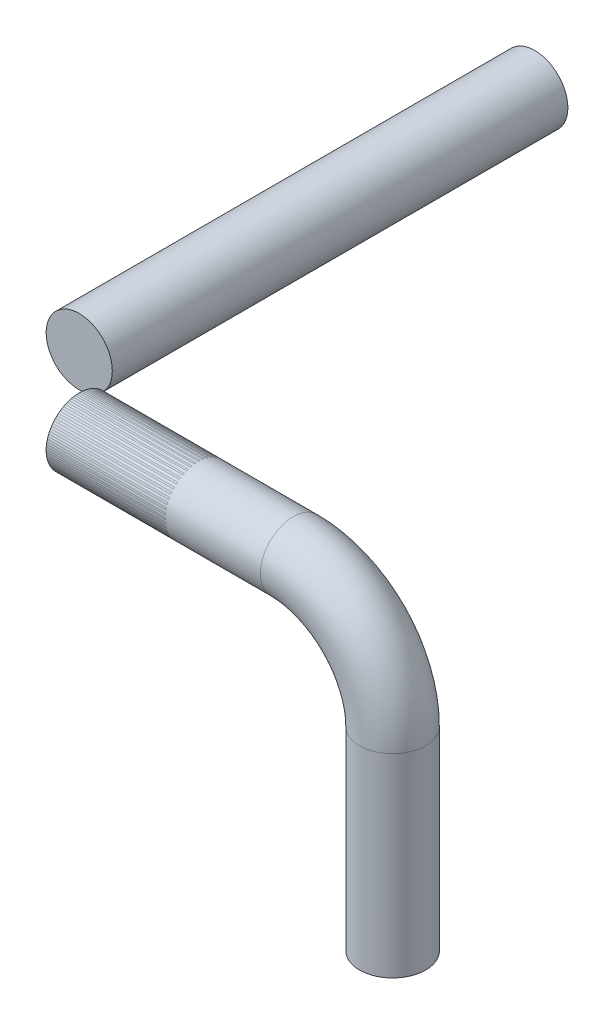
ISO-10303-21;
HEADER;
FILE_DESCRIPTION(('STEP AP214'),'2;1');
FILE_NAME('part.step','',(''),(''),'','','');
FILE_SCHEMA(('AUTOMOTIVE_DESIGN { 1 0 10303 214 1 1 1 1 }'));
ENDSEC;
DATA;
#1=APPLICATION_CONTEXT('core data for automotive mechanical design processes');
#2=APPLICATION_PROTOCOL_DEFINITION('international standard','automotive_design',2000,#1);
#3=PRODUCT_CONTEXT('',#1,'mechanical');
#4=PRODUCT('Part','Part','',(#3));
#5=PRODUCT_RELATED_PRODUCT_CATEGORY('part','',(#4));
#6=PRODUCT_DEFINITION_FORMATION('','',#4);
#7=PRODUCT_DEFINITION_CONTEXT('part definition',#1,'design');
#8=PRODUCT_DEFINITION('design','',#6,#7);
#9=PRODUCT_DEFINITION_SHAPE('','',#8);
#10=(LENGTH_UNIT() NAMED_UNIT(*) SI_UNIT(.MILLI.,.METRE.));
#11=(NAMED_UNIT(*) PLANE_ANGLE_UNIT() SI_UNIT($,.RADIAN.));
#12=(NAMED_UNIT(*) SI_UNIT($,.STERADIAN.) SOLID_ANGLE_UNIT());
#13=UNCERTAINTY_MEASURE_WITH_UNIT(LENGTH_MEASURE(1.E-05),#10,'distance_accuracy_value','');
#14=(GEOMETRIC_REPRESENTATION_CONTEXT(3) GLOBAL_UNCERTAINTY_ASSIGNED_CONTEXT((#13)) GLOBAL_UNIT_ASSIGNED_CONTEXT((#10,
#11,#12)) REPRESENTATION_CONTEXT('',''));
#15=CARTESIAN_POINT('',(0.,0.,0.));
#16=DIRECTION('',(0.,0.,1.));
#17=DIRECTION('',(1.,0.,0.));
#18=AXIS2_PLACEMENT_3D('',#15,#16,#17);
#19=CARTESIAN_POINT('',(0.,0.,84.0740000000007));
#20=DIRECTION('',(0.,0.,-1.));
#21=DIRECTION('',(-1.,0.,0.));
#22=AXIS2_PLACEMENT_3D('',#19,#20,#21);
#23=PLANE('',#22);
#24=CARTESIAN_POINT('',(0.,0.,84.0740000000007));
#25=DIRECTION('',(0.,0.,-1.));
#26=DIRECTION('',(-1.,0.,0.));
#27=AXIS2_PLACEMENT_3D('',#24,#25,#26);
#28=CIRCLE('',#27,6.35);
#29=CARTESIAN_POINT('',(-6.35,0.,84.0740000000007));
#30=VERTEX_POINT('',#29);
#31=EDGE_CURVE('E53',#30,#30,#28,.T.);
#32=ORIENTED_EDGE('',*,*,#31,.F.);
#33=EDGE_LOOP('',(#32));
#34=FACE_BOUND('',#33,.T.);
#35=ADVANCED_FACE('F46',(#34),#23,.F.);
#36=CARTESIAN_POINT('',(0.,0.,-21.3387122421383));
#37=DIRECTION('',(0.,0.,1.));
#38=DIRECTION('',(1.,0.,0.));
#39=AXIS2_PLACEMENT_3D('',#36,#37,#38);
#40=CYLINDRICAL_SURFACE('',#39,6.35);
#41=CARTESIAN_POINT('',(0.,0.,-3.37819999999999));
#42=DIRECTION('',(0.,0.,1.));
#43=DIRECTION('',(1.,0.,0.));
#44=AXIS2_PLACEMENT_3D('',#41,#42,#43);
#45=CIRCLE('',#44,6.35);
#46=CARTESIAN_POINT('',(6.35,0.,-3.37819999999999));
#47=VERTEX_POINT('',#46);
#48=EDGE_CURVE('E11',#47,#47,#45,.T.);
#49=ORIENTED_EDGE('',*,*,#48,.T.);
#50=EDGE_LOOP('',(#49));
#51=FACE_BOUND('',#50,.T.);
#52=ORIENTED_EDGE('',*,*,#31,.T.);
#53=EDGE_LOOP('',(#52));
#54=FACE_BOUND('',#53,.T.);
#55=ADVANCED_FACE('F48',(#51,#54),#40,.T.);
#56=CARTESIAN_POINT('',(0.,0.,-3.37819999999999));
#57=DIRECTION('',(0.,0.,1.));
#58=DIRECTION('',(1.,0.,0.));
#59=AXIS2_PLACEMENT_3D('',#56,#57,#58);
#60=PLANE('',#59);
#61=ORIENTED_EDGE('',*,*,#48,.F.);
#62=EDGE_LOOP('',(#61));
#63=FACE_BOUND('',#62,.T.);
#64=ADVANCED_FACE('F64',(#63),#60,.F.);
#65=CLOSED_SHELL('',(#35,#55,#64));
#66=MANIFOLD_SOLID_BREP('B2',#65);
#67=CARTESIAN_POINT('',(54.3147558894614,0.,97.2819999999932));
#68=DIRECTION('',(-1.,0.,0.));
#69=DIRECTION('',(0.,-1.,0.));
#70=AXIS2_PLACEMENT_3D('',#67,#68,#69);
#71=CYLINDRICAL_SURFACE('',#70,6.34999999999005);
#72=CARTESIAN_POINT('',(54.3147558894614,0.,97.2819999999932));
#73=DIRECTION('',(1.,0.,0.));
#74=DIRECTION('',(0.,0.,-1.));
#75=AXIS2_PLACEMENT_3D('',#72,#73,#74);
#76=CIRCLE('',#75,6.34999999999005);
#77=CARTESIAN_POINT('',(54.3147558894614,6.34999999999002,97.2819999999932));
#78=VERTEX_POINT('',#77);
#79=EDGE_CURVE('E101',#78,#78,#76,.T.);
#80=ORIENTED_EDGE('',*,*,#79,.F.);
#81=EDGE_LOOP('',(#80));
#82=FACE_BOUND('',#81,.T.);
#83=CARTESIAN_POINT('',(13.2080000000033,1.2672202162533E-12,97.2819999999932));
#84=DIRECTION('',(1.,0.,0.));
#85=DIRECTION('',(0.,0.,-1.));
#86=AXIS2_PLACEMENT_3D('',#83,#84,#85);
#87=CIRCLE('',#86,6.34999999999005);
#88=CARTESIAN_POINT('',(13.2080000000033,1.2672202162533E-12,90.9320000000032));
#89=VERTEX_POINT('',#88);
#90=EDGE_CURVE('E45',#89,#89,#87,.T.);
#91=ORIENTED_EDGE('',*,*,#90,.T.);
#92=EDGE_LOOP('',(#91));
#93=FACE_BOUND('',#92,.T.);
#94=ADVANCED_FACE('F95',(#82,#93),#71,.T.);
#95=CARTESIAN_POINT('',(54.3147558894615,-19.05,97.2819999999932));
#96=DIRECTION('',(0.,0.,1.));
#97=DIRECTION('',(1.,0.,0.));
#98=AXIS2_PLACEMENT_3D('',#95,#96,#97);
#99=TOROIDAL_SURFACE('',#98,19.05,6.34999999999005);
#100=CARTESIAN_POINT('',(73.3647558894614,-19.05,97.2819999999932));
#101=DIRECTION('',(0.,-1.,0.));
#102=DIRECTION('',(0.,0.,-1.));
#103=AXIS2_PLACEMENT_3D('',#100,#101,#102);
#104=CIRCLE('',#103,6.34999999999005);
#105=CARTESIAN_POINT('',(79.7147558894515,-19.05,97.2819999999932));
#106=VERTEX_POINT('',#105);
#107=EDGE_CURVE('E105',#106,#106,#104,.T.);
#108=CARTESIAN_POINT('',(54.3147558894615,-19.05,97.2819999999932));
#109=DIRECTION('',(0.,0.,1.));
#110=DIRECTION('',(1.,0.,0.));
#111=AXIS2_PLACEMENT_3D('',#108,#109,#110);
#112=CIRCLE('',#111,25.39999999999);
#113=EDGE_CURVE('',#106,#78,#112,.T.);
#114=ORIENTED_EDGE('',*,*,#107,.F.);
#115=ORIENTED_EDGE('',*,*,#79,.T.);
#116=ORIENTED_EDGE('',*,*,#113,.T.);
#117=ORIENTED_EDGE('',*,*,#113,.F.);
#118=EDGE_LOOP('',(#114,#116,#115,#117));
#119=FACE_BOUND('',#118,.T.);
#120=ADVANCED_FACE('F120',(#119),#99,.T.);
#121=CARTESIAN_POINT('',(73.3647558894614,-19.05,97.2819999999932));
#122=DIRECTION('',(0.,-1.,0.));
#123=DIRECTION('',(1.,0.,0.));
#124=AXIS2_PLACEMENT_3D('',#121,#122,#123);
#125=CYLINDRICAL_SURFACE('',#124,6.34999999999005);
#126=ORIENTED_EDGE('',*,*,#107,.T.);
#127=EDGE_LOOP('',(#126));
#128=FACE_BOUND('',#127,.T.);
#129=CARTESIAN_POINT('',(73.3647558894614,-56.3428997600621,97.2819999999932));
#130=DIRECTION('',(0.,-1.,0.));
#131=DIRECTION('',(0.,0.,-1.));
#132=AXIS2_PLACEMENT_3D('',#129,#130,#131);
#133=CIRCLE('',#132,6.34999999999005);
#134=CARTESIAN_POINT('',(73.3647558894614,-56.3428997600621,90.9320000000032));
#135=VERTEX_POINT('',#134);
#136=EDGE_CURVE('E109',#135,#135,#133,.T.);
#137=ORIENTED_EDGE('',*,*,#136,.F.);
#138=EDGE_LOOP('',(#137));
#139=FACE_BOUND('',#138,.T.);
#140=ADVANCED_FACE('F117',(#128,#139),#125,.T.);
#141=CARTESIAN_POINT('',(13.2080000000033,1.2672202162533E-12,97.2819999999932));
#142=DIRECTION('',(1.,0.,0.));
#143=DIRECTION('',(0.,0.,-1.));
#144=AXIS2_PLACEMENT_3D('',#141,#142,#143);
#145=PLANE('',#144);
#146=ORIENTED_EDGE('',*,*,#90,.F.);
#147=EDGE_LOOP('',(#146));
#148=FACE_BOUND('',#147,.T.);
#149=ADVANCED_FACE('F119',(#148),#145,.F.);
#150=CARTESIAN_POINT('',(73.3647558894614,-56.3428997600621,97.2819999999932));
#151=DIRECTION('',(0.,-1.,0.));
#152=DIRECTION('',(0.,0.,-1.));
#153=AXIS2_PLACEMENT_3D('',#150,#151,#152);
#154=PLANE('',#153);
#155=ORIENTED_EDGE('',*,*,#136,.T.);
#156=EDGE_LOOP('',(#155));
#157=FACE_BOUND('',#156,.T.);
#158=ADVANCED_FACE('F115',(#157),#154,.T.);
#159=CLOSED_SHELL('',(#94,#120,#140,#149,#158));
#160=MANIFOLD_SOLID_BREP('B6',#159);
#161=CARTESIAN_POINT('',(24.638000000013,5.59447940308136E-12,97.2820000000012));
#162=DIRECTION('',(-1.,0.,0.));
#163=DIRECTION('',(0.,0.,1.));
#164=AXIS2_PLACEMENT_3D('',#161,#162,#163);
#165=CYLINDRICAL_SURFACE('',#164,6.35);
#166=CARTESIAN_POINT('',(36.068000000013,5.7587475566647E-12,97.2820000000012));
#167=DIRECTION('',(-1.,0.,0.));
#168=DIRECTION('',(0.,0.,1.));
#169=AXIS2_PLACEMENT_3D('',#166,#167,#168);
#170=CIRCLE('',#169,6.35);
#171=CARTESIAN_POINT('',(36.068000000013,5.75779447227563E-12,103.632000000001));
#172=VERTEX_POINT('',#171);
#173=EDGE_CURVE('E178',#172,#172,#170,.T.);
#174=ORIENTED_EDGE('',*,*,#173,.F.);
#175=EDGE_LOOP('',(#174));
#176=FACE_BOUND('',#175,.T.);
#177=CARTESIAN_POINT('',(13.208000000013,5.43021124949803E-12,97.2820000000012));
#178=DIRECTION('',(-1.,0.,0.));
#179=DIRECTION('',(0.,0.,1.));
#180=AXIS2_PLACEMENT_3D('',#177,#178,#179);
#181=CIRCLE('',#180,6.35);
#182=CARTESIAN_POINT('',(13.208000000013,5.42925816510895E-12,103.632000000001));
#183=VERTEX_POINT('',#182);
#184=EDGE_CURVE('E94',#183,#183,#181,.F.);
#185=ORIENTED_EDGE('',*,*,#184,.F.);
#186=EDGE_LOOP('',(#185));
#187=FACE_BOUND('',#186,.T.);
#188=ADVANCED_FACE('F174',(#176,#187),#165,.F.);
#189=OPEN_SHELL('',(#188));
#190=SHELL_BASED_SURFACE_MODEL('B40',(#189));
#191=ADVANCED_BREP_SHAPE_REPRESENTATION('',(#18,#66,#160),#14);
#192=MANIFOLD_SURFACE_SHAPE_REPRESENTATION('',(#18,#190),#14);
#193=SHAPE_REPRESENTATION('',(#18),#14);
#194=SHAPE_DEFINITION_REPRESENTATION(#9,#193);
#195=SHAPE_REPRESENTATION_RELATIONSHIP('','',#193,#191);
#196=SHAPE_REPRESENTATION_RELATIONSHIP('','',#193,#192);
ENDSEC;
END-ISO-10303-21;
